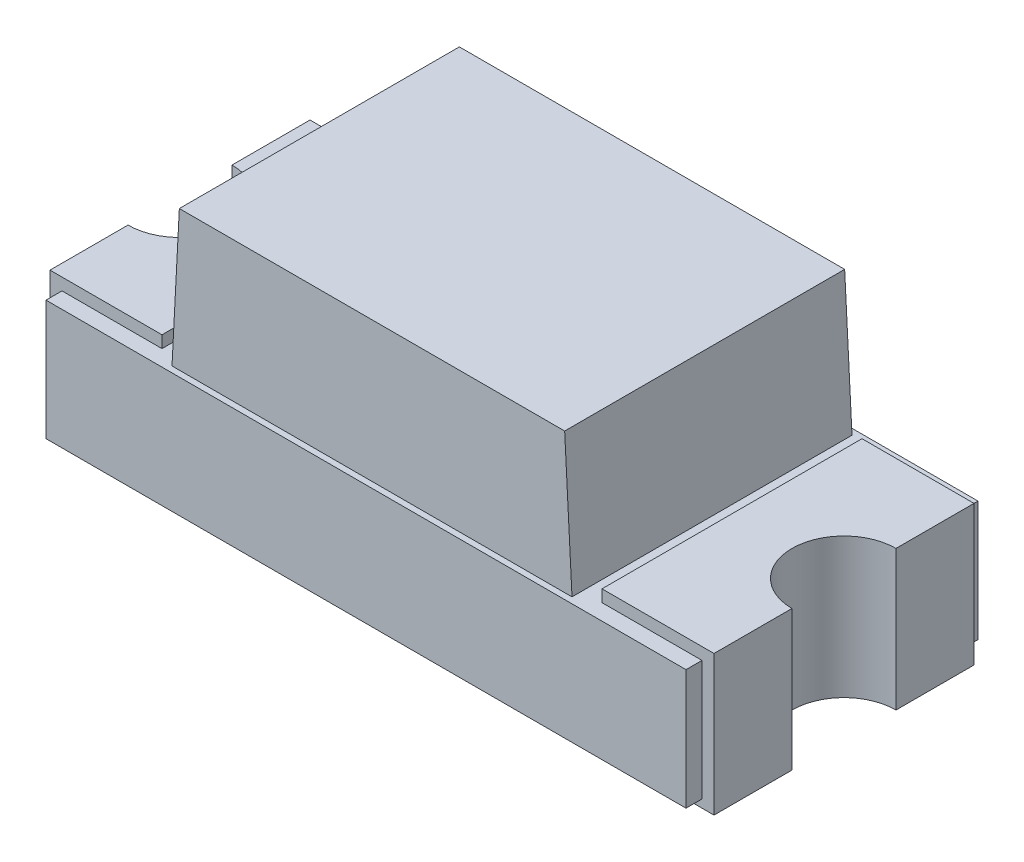
ISO-10303-21;
HEADER;
FILE_DESCRIPTION(('STEP AP214'),'2;1');
FILE_NAME('part.step','',(''),(''),'','','');
FILE_SCHEMA(('AUTOMOTIVE_DESIGN { 1 0 10303 214 1 1 1 1 }'));
ENDSEC;
DATA;
#1=APPLICATION_CONTEXT('core data for automotive mechanical design processes');
#2=APPLICATION_PROTOCOL_DEFINITION('international standard','automotive_design',2000,#1);
#3=PRODUCT_CONTEXT('',#1,'mechanical');
#4=PRODUCT('Part','Part','',(#3));
#5=PRODUCT_RELATED_PRODUCT_CATEGORY('part','',(#4));
#6=PRODUCT_DEFINITION_FORMATION('','',#4);
#7=PRODUCT_DEFINITION_CONTEXT('part definition',#1,'design');
#8=PRODUCT_DEFINITION('design','',#6,#7);
#9=PRODUCT_DEFINITION_SHAPE('','',#8);
#10=(LENGTH_UNIT() NAMED_UNIT(*) SI_UNIT(.MILLI.,.METRE.));
#11=(NAMED_UNIT(*) PLANE_ANGLE_UNIT() SI_UNIT($,.RADIAN.));
#12=(NAMED_UNIT(*) SI_UNIT($,.STERADIAN.) SOLID_ANGLE_UNIT());
#13=UNCERTAINTY_MEASURE_WITH_UNIT(LENGTH_MEASURE(1.E-05),#10,'distance_accuracy_value','');
#14=(GEOMETRIC_REPRESENTATION_CONTEXT(3) GLOBAL_UNCERTAINTY_ASSIGNED_CONTEXT((#13)) GLOBAL_UNIT_ASSIGNED_CONTEXT((#10,
#11,#12)) REPRESENTATION_CONTEXT('',''));
#15=CARTESIAN_POINT('',(0.,0.,0.));
#16=DIRECTION('',(0.,0.,1.));
#17=DIRECTION('',(1.,0.,0.));
#18=AXIS2_PLACEMENT_3D('',#15,#16,#17);
#19=CARTESIAN_POINT('',(0.,0.15,0.));
#20=DIRECTION('',(0.,1.,0.));
#21=DIRECTION('',(0.,0.,1.));
#22=AXIS2_PLACEMENT_3D('',#19,#20,#21);
#23=PLANE('',#22);
#24=DIRECTION('',(0.,0.,-1.));
#25=VECTOR('',#24,1.);
#26=CARTESIAN_POINT('',(0.800000000000004,0.15,-0.365));
#27=LINE('',#26,#25);
#28=CARTESIAN_POINT('',(0.800000000000004,0.15,0.365));
#29=VERTEX_POINT('',#28);
#30=CARTESIAN_POINT('',(0.800000000000004,0.15,0.325));
#31=VERTEX_POINT('',#30);
#32=EDGE_CURVE('E224',#29,#31,#27,.T.);
#33=ORIENTED_EDGE('',*,*,#32,.T.);
#34=DIRECTION('',(-1.,0.,0.));
#35=VECTOR('',#34,1.);
#36=CARTESIAN_POINT('',(0.,0.15,0.325));
#37=LINE('',#36,#35);
#38=CARTESIAN_POINT('',(0.549999999999996,0.15,0.325));
#39=VERTEX_POINT('',#38);
#40=EDGE_CURVE('E218',#31,#39,#37,.T.);
#41=ORIENTED_EDGE('',*,*,#40,.T.);
#42=DIRECTION('',(0.,0.,-1.));
#43=VECTOR('',#42,1.);
#44=CARTESIAN_POINT('',(0.549999999999996,0.15,0.));
#45=LINE('',#44,#43);
#46=CARTESIAN_POINT('',(0.549999999999996,0.15,-0.325));
#47=VERTEX_POINT('',#46);
#48=EDGE_CURVE('E221',#39,#47,#45,.T.);
#49=ORIENTED_EDGE('',*,*,#48,.T.);
#50=DIRECTION('',(1.,0.,0.));
#51=VECTOR('',#50,1.);
#52=CARTESIAN_POINT('',(0.,0.15,-0.325));
#53=LINE('',#52,#51);
#54=CARTESIAN_POINT('',(0.800000000000004,0.15,-0.325));
#55=VERTEX_POINT('',#54);
#56=EDGE_CURVE('E238',#47,#55,#53,.T.);
#57=ORIENTED_EDGE('',*,*,#56,.T.);
#58=CARTESIAN_POINT('',(0.800000000000004,0.15,-0.365));
#59=VERTEX_POINT('',#58);
#60=EDGE_CURVE('E323',#55,#59,#27,.T.);
#61=ORIENTED_EDGE('',*,*,#60,.T.);
#62=DIRECTION('',(-1.,0.,0.));
#63=VECTOR('',#62,1.);
#64=CARTESIAN_POINT('',(-0.799999999999996,0.15,-0.365));
#65=LINE('',#64,#63);
#66=CARTESIAN_POINT('',(-0.799999999999996,0.15,-0.365));
#67=VERTEX_POINT('',#66);
#68=EDGE_CURVE('E322',#59,#67,#65,.T.);
#69=ORIENTED_EDGE('',*,*,#68,.T.);
#70=DIRECTION('',(0.,0.,1.));
#71=VECTOR('',#70,1.);
#72=CARTESIAN_POINT('',(-0.799999999999996,0.15,-0.365));
#73=LINE('',#72,#71);
#74=CARTESIAN_POINT('',(-0.799999999999996,0.15,-0.325));
#75=VERTEX_POINT('',#74);
#76=EDGE_CURVE('E326',#67,#75,#73,.T.);
#77=ORIENTED_EDGE('',*,*,#76,.T.);
#78=DIRECTION('',(-1.,0.,0.));
#79=VECTOR('',#78,1.);
#80=CARTESIAN_POINT('',(0.,0.15,-0.325));
#81=LINE('',#80,#79);
#82=CARTESIAN_POINT('',(-0.549999999999996,0.15,-0.325));
#83=VERTEX_POINT('',#82);
#84=EDGE_CURVE('E318',#83,#75,#81,.T.);
#85=ORIENTED_EDGE('',*,*,#84,.F.);
#86=DIRECTION('',(0.,0.,-1.));
#87=VECTOR('',#86,1.);
#88=CARTESIAN_POINT('',(-0.549999999999996,0.15,0.));
#89=LINE('',#88,#87);
#90=CARTESIAN_POINT('',(-0.549999999999996,0.15,0.325));
#91=VERTEX_POINT('',#90);
#92=EDGE_CURVE('E313',#91,#83,#89,.T.);
#93=ORIENTED_EDGE('',*,*,#92,.F.);
#94=DIRECTION('',(1.,0.,0.));
#95=VECTOR('',#94,1.);
#96=CARTESIAN_POINT('',(0.,0.15,0.325));
#97=LINE('',#96,#95);
#98=CARTESIAN_POINT('',(-0.799999999999996,0.15,0.325));
#99=VERTEX_POINT('',#98);
#100=EDGE_CURVE('E311',#99,#91,#97,.T.);
#101=ORIENTED_EDGE('',*,*,#100,.F.);
#102=CARTESIAN_POINT('',(-0.799999999999996,0.15,0.365));
#103=VERTEX_POINT('',#102);
#104=EDGE_CURVE('E325',#99,#103,#73,.T.);
#105=ORIENTED_EDGE('',*,*,#104,.T.);
#106=DIRECTION('',(1.,0.,0.));
#107=VECTOR('',#106,1.);
#108=CARTESIAN_POINT('',(-0.799999999999996,0.15,0.365));
#109=LINE('',#108,#107);
#110=EDGE_CURVE('E329',#103,#29,#109,.T.);
#111=ORIENTED_EDGE('',*,*,#110,.T.);
#112=EDGE_LOOP('',(#33,#41,#49,#57,#61,#69,#77,#85,#93,#101,#105,#111));
#113=FACE_BOUND('',#112,.T.);
#114=DIRECTION('',(1.,0.,0.));
#115=VECTOR('',#114,1.);
#116=CARTESIAN_POINT('',(0.5,0.15,0.35));
#117=LINE('',#116,#115);
#118=CARTESIAN_POINT('',(-0.5,0.15,0.35));
#119=VERTEX_POINT('',#118);
#120=CARTESIAN_POINT('',(0.5,0.15,0.35));
#121=VERTEX_POINT('',#120);
#122=EDGE_CURVE('E390',#119,#121,#117,.T.);
#123=ORIENTED_EDGE('',*,*,#122,.F.);
#124=DIRECTION('',(0.,0.,1.));
#125=VECTOR('',#124,1.);
#126=CARTESIAN_POINT('',(-0.5,0.15,0.35));
#127=LINE('',#126,#125);
#128=CARTESIAN_POINT('',(-0.5,0.15,-0.35));
#129=VERTEX_POINT('',#128);
#130=EDGE_CURVE('E717',#129,#119,#127,.T.);
#131=ORIENTED_EDGE('',*,*,#130,.F.);
#132=DIRECTION('',(-1.,0.,0.));
#133=VECTOR('',#132,1.);
#134=CARTESIAN_POINT('',(0.5,0.15,-0.35));
#135=LINE('',#134,#133);
#136=CARTESIAN_POINT('',(0.5,0.15,-0.35));
#137=VERTEX_POINT('',#136);
#138=EDGE_CURVE('E383',#137,#129,#135,.T.);
#139=ORIENTED_EDGE('',*,*,#138,.F.);
#140=DIRECTION('',(0.,0.,-1.));
#141=VECTOR('',#140,1.);
#142=CARTESIAN_POINT('',(0.5,0.15,0.35));
#143=LINE('',#142,#141);
#144=EDGE_CURVE('E387',#121,#137,#143,.T.);
#145=ORIENTED_EDGE('',*,*,#144,.F.);
#146=EDGE_LOOP('',(#123,#131,#139,#145));
#147=FACE_BOUND('',#146,.T.);
#148=ADVANCED_FACE('F34',(#113,#147),#23,.T.);
#149=CARTESIAN_POINT('',(0.829999999999996,-0.17,-0.325));
#150=DIRECTION('',(-1.,0.,0.));
#151=DIRECTION('',(0.,0.,1.));
#152=AXIS2_PLACEMENT_3D('',#149,#150,#151);
#153=PLANE('',#152);
#154=DIRECTION('',(0.,1.,0.));
#155=VECTOR('',#154,1.);
#156=CARTESIAN_POINT('',(0.829999999999996,-0.5,0.13));
#157=LINE('',#156,#155);
#158=CARTESIAN_POINT('',(0.829999999999996,0.18,0.13));
#159=VERTEX_POINT('',#158);
#160=CARTESIAN_POINT('',(0.829999999999996,-0.17,0.13));
#161=VERTEX_POINT('',#160);
#162=EDGE_CURVE('E396',#159,#161,#157,.F.);
#163=ORIENTED_EDGE('',*,*,#162,.F.);
#164=DIRECTION('',(0.,0.,1.));
#165=VECTOR('',#164,1.);
#166=CARTESIAN_POINT('',(0.829999999999996,0.18,-0.325));
#167=LINE('',#166,#165);
#168=CARTESIAN_POINT('',(0.829999999999996,0.18,0.325));
#169=VERTEX_POINT('',#168);
#170=EDGE_CURVE('E400',#159,#169,#167,.T.);
#171=ORIENTED_EDGE('',*,*,#170,.T.);
#172=DIRECTION('',(0.,1.,0.));
#173=VECTOR('',#172,1.);
#174=CARTESIAN_POINT('',(0.829999999999996,-0.17,0.325));
#175=LINE('',#174,#173);
#176=CARTESIAN_POINT('',(0.829999999999996,-0.17,0.325));
#177=VERTEX_POINT('',#176);
#178=EDGE_CURVE('E249',#177,#169,#175,.T.);
#179=ORIENTED_EDGE('',*,*,#178,.F.);
#180=DIRECTION('',(0.,0.,1.));
#181=VECTOR('',#180,1.);
#182=CARTESIAN_POINT('',(0.829999999999996,-0.17,-0.325));
#183=LINE('',#182,#181);
#184=EDGE_CURVE('E405',#161,#177,#183,.T.);
#185=ORIENTED_EDGE('',*,*,#184,.F.);
#186=EDGE_LOOP('',(#163,#171,#179,#185));
#187=FACE_BOUND('',#186,.T.);
#188=ADVANCED_FACE('F425',(#187),#153,.F.);
#189=DIRECTION('',(0.,1.,0.));
#190=VECTOR('',#189,1.);
#191=CARTESIAN_POINT('',(0.829999999999996,-0.5,-0.13));
#192=LINE('',#191,#190);
#193=CARTESIAN_POINT('',(0.829999999999996,-0.17,-0.13));
#194=VERTEX_POINT('',#193);
#195=CARTESIAN_POINT('',(0.829999999999996,0.18,-0.13));
#196=VERTEX_POINT('',#195);
#197=EDGE_CURVE('E394',#194,#196,#192,.T.);
#198=ORIENTED_EDGE('',*,*,#197,.F.);
#199=CARTESIAN_POINT('',(0.829999999999996,-0.17,-0.325));
#200=VERTEX_POINT('',#199);
#201=EDGE_CURVE('E401',#200,#194,#183,.T.);
#202=ORIENTED_EDGE('',*,*,#201,.F.);
#203=DIRECTION('',(0.,1.,0.));
#204=VECTOR('',#203,1.);
#205=CARTESIAN_POINT('',(0.829999999999996,-0.17,-0.325));
#206=LINE('',#205,#204);
#207=CARTESIAN_POINT('',(0.829999999999996,0.18,-0.325));
#208=VERTEX_POINT('',#207);
#209=EDGE_CURVE('E255',#200,#208,#206,.T.);
#210=ORIENTED_EDGE('',*,*,#209,.T.);
#211=EDGE_CURVE('E410',#208,#196,#167,.T.);
#212=ORIENTED_EDGE('',*,*,#211,.T.);
#213=EDGE_LOOP('',(#198,#202,#210,#212));
#214=FACE_BOUND('',#213,.T.);
#215=ADVANCED_FACE('F438',(#214),#153,.F.);
#216=CARTESIAN_POINT('',(0.,-0.17,0.));
#217=DIRECTION('',(0.,1.,0.));
#218=DIRECTION('',(0.,0.,1.));
#219=AXIS2_PLACEMENT_3D('',#216,#217,#218);
#220=PLANE('',#219);
#221=CARTESIAN_POINT('',(0.829999999999996,-0.17,0.));
#222=DIRECTION('',(0.,1.,0.));
#223=DIRECTION('',(0.,0.,1.));
#224=AXIS2_PLACEMENT_3D('',#221,#222,#223);
#225=CIRCLE('',#224,0.13);
#226=EDGE_CURVE('E398',#161,#194,#225,.F.);
#227=ORIENTED_EDGE('',*,*,#226,.F.);
#228=ORIENTED_EDGE('',*,*,#184,.T.);
#229=DIRECTION('',(-1.,0.,0.));
#230=VECTOR('',#229,1.);
#231=CARTESIAN_POINT('',(0.829999999999996,-0.17,0.325));
#232=LINE('',#231,#230);
#233=CARTESIAN_POINT('',(0.549999999999996,-0.17,0.325));
#234=VERTEX_POINT('',#233);
#235=EDGE_CURVE('E258',#177,#234,#232,.T.);
#236=ORIENTED_EDGE('',*,*,#235,.T.);
#237=DIRECTION('',(0.,0.,-1.));
#238=VECTOR('',#237,1.);
#239=CARTESIAN_POINT('',(0.549999999999996,-0.17,-0.325));
#240=LINE('',#239,#238);
#241=CARTESIAN_POINT('',(0.549999999999996,-0.17,-0.325));
#242=VERTEX_POINT('',#241);
#243=EDGE_CURVE('E407',#234,#242,#240,.T.);
#244=ORIENTED_EDGE('',*,*,#243,.T.);
#245=DIRECTION('',(1.,0.,0.));
#246=VECTOR('',#245,1.);
#247=CARTESIAN_POINT('',(0.829999999999996,-0.17,-0.325));
#248=LINE('',#247,#246);
#249=EDGE_CURVE('E404',#242,#200,#248,.T.);
#250=ORIENTED_EDGE('',*,*,#249,.T.);
#251=ORIENTED_EDGE('',*,*,#201,.T.);
#252=EDGE_LOOP('',(#227,#228,#236,#244,#250,#251));
#253=FACE_BOUND('',#252,.T.);
#254=ADVANCED_FACE('F420',(#253),#220,.F.);
#255=CARTESIAN_POINT('',(0.,0.18,0.));
#256=DIRECTION('',(0.,1.,0.));
#257=DIRECTION('',(0.,0.,1.));
#258=AXIS2_PLACEMENT_3D('',#255,#256,#257);
#259=PLANE('',#258);
#260=ORIENTED_EDGE('',*,*,#170,.F.);
#261=CARTESIAN_POINT('',(0.829999999999996,0.18,0.));
#262=DIRECTION('',(0.,1.,0.));
#263=DIRECTION('',(0.,0.,1.));
#264=AXIS2_PLACEMENT_3D('',#261,#262,#263);
#265=CIRCLE('',#264,0.13);
#266=EDGE_CURVE('E11',#159,#196,#265,.F.);
#267=ORIENTED_EDGE('',*,*,#266,.T.);
#268=ORIENTED_EDGE('',*,*,#211,.F.);
#269=DIRECTION('',(1.,0.,0.));
#270=VECTOR('',#269,1.);
#271=CARTESIAN_POINT('',(0.829999999999996,0.18,-0.325));
#272=LINE('',#271,#270);
#273=CARTESIAN_POINT('',(0.549999999999996,0.18,-0.325));
#274=VERTEX_POINT('',#273);
#275=EDGE_CURVE('E413',#274,#208,#272,.T.);
#276=ORIENTED_EDGE('',*,*,#275,.F.);
#277=DIRECTION('',(0.,0.,-1.));
#278=VECTOR('',#277,1.);
#279=CARTESIAN_POINT('',(0.549999999999996,0.18,-0.325));
#280=LINE('',#279,#278);
#281=CARTESIAN_POINT('',(0.549999999999996,0.18,0.325));
#282=VERTEX_POINT('',#281);
#283=EDGE_CURVE('E415',#282,#274,#280,.T.);
#284=ORIENTED_EDGE('',*,*,#283,.F.);
#285=DIRECTION('',(-1.,0.,0.));
#286=VECTOR('',#285,1.);
#287=CARTESIAN_POINT('',(0.829999999999996,0.18,0.325));
#288=LINE('',#287,#286);
#289=EDGE_CURVE('E243',#169,#282,#288,.T.);
#290=ORIENTED_EDGE('',*,*,#289,.F.);
#291=EDGE_LOOP('',(#260,#267,#268,#276,#284,#290));
#292=FACE_BOUND('',#291,.T.);
#293=ADVANCED_FACE('F428',(#292),#259,.T.);
#294=CARTESIAN_POINT('',(0.800000000000004,0.15,-0.365));
#295=DIRECTION('',(-1.,0.,0.));
#296=DIRECTION('',(0.,0.,1.));
#297=AXIS2_PLACEMENT_3D('',#294,#295,#296);
#298=PLANE('',#297);
#299=DIRECTION('',(0.,-1.,0.));
#300=VECTOR('',#299,1.);
#301=CARTESIAN_POINT('',(0.800000000000004,0.15,0.325));
#302=LINE('',#301,#300);
#303=CARTESIAN_POINT('',(0.800000000000004,-0.15,0.325));
#304=VERTEX_POINT('',#303);
#305=EDGE_CURVE('E229',#31,#304,#302,.T.);
#306=ORIENTED_EDGE('',*,*,#305,.F.);
#307=ORIENTED_EDGE('',*,*,#32,.F.);
#308=DIRECTION('',(0.,-1.,0.));
#309=VECTOR('',#308,1.);
#310=CARTESIAN_POINT('',(0.800000000000004,0.15,0.365));
#311=LINE('',#310,#309);
#312=CARTESIAN_POINT('',(0.800000000000004,-0.15,0.365));
#313=VERTEX_POINT('',#312);
#314=EDGE_CURVE('E331',#29,#313,#311,.T.);
#315=ORIENTED_EDGE('',*,*,#314,.T.);
#316=DIRECTION('',(0.,0.,-1.));
#317=VECTOR('',#316,1.);
#318=CARTESIAN_POINT('',(0.800000000000004,-0.15,-0.365));
#319=LINE('',#318,#317);
#320=EDGE_CURVE('E332',#313,#304,#319,.T.);
#321=ORIENTED_EDGE('',*,*,#320,.T.);
#322=EDGE_LOOP('',(#306,#307,#315,#321));
#323=FACE_BOUND('',#322,.T.);
#324=ADVANCED_FACE('F446',(#323),#298,.F.);
#325=DIRECTION('',(0.,1.,0.));
#326=VECTOR('',#325,1.);
#327=CARTESIAN_POINT('',(0.800000000000004,0.15,-0.325));
#328=LINE('',#327,#326);
#329=CARTESIAN_POINT('',(0.800000000000004,-0.15,-0.325));
#330=VERTEX_POINT('',#329);
#331=EDGE_CURVE('E259',#330,#55,#328,.T.);
#332=ORIENTED_EDGE('',*,*,#331,.F.);
#333=CARTESIAN_POINT('',(0.800000000000004,-0.15,-0.365));
#334=VERTEX_POINT('',#333);
#335=EDGE_CURVE('E320',#330,#334,#319,.T.);
#336=ORIENTED_EDGE('',*,*,#335,.T.);
#337=DIRECTION('',(0.,-1.,0.));
#338=VECTOR('',#337,1.);
#339=CARTESIAN_POINT('',(0.800000000000004,0.15,-0.365));
#340=LINE('',#339,#338);
#341=EDGE_CURVE('E351',#59,#334,#340,.T.);
#342=ORIENTED_EDGE('',*,*,#341,.F.);
#343=ORIENTED_EDGE('',*,*,#60,.F.);
#344=EDGE_LOOP('',(#332,#336,#342,#343));
#345=FACE_BOUND('',#344,.T.);
#346=ADVANCED_FACE('F501',(#345),#298,.F.);
#347=CARTESIAN_POINT('',(0.,-0.15,0.));
#348=DIRECTION('',(0.,1.,0.));
#349=DIRECTION('',(0.,0.,1.));
#350=AXIS2_PLACEMENT_3D('',#347,#348,#349);
#351=PLANE('',#350);
#352=DIRECTION('',(-1.,0.,0.));
#353=VECTOR('',#352,1.);
#354=CARTESIAN_POINT('',(0.,-0.15,0.325));
#355=LINE('',#354,#353);
#356=CARTESIAN_POINT('',(0.549999999999996,-0.15,0.325));
#357=VERTEX_POINT('',#356);
#358=EDGE_CURVE('E44',#304,#357,#355,.T.);
#359=ORIENTED_EDGE('',*,*,#358,.F.);
#360=ORIENTED_EDGE('',*,*,#320,.F.);
#361=DIRECTION('',(1.,0.,0.));
#362=VECTOR('',#361,1.);
#363=CARTESIAN_POINT('',(-0.799999999999996,-0.15,0.365));
#364=LINE('',#363,#362);
#365=CARTESIAN_POINT('',(-0.799999999999996,-0.15,0.365));
#366=VERTEX_POINT('',#365);
#367=EDGE_CURVE('E341',#366,#313,#364,.T.);
#368=ORIENTED_EDGE('',*,*,#367,.F.);
#369=DIRECTION('',(0.,0.,1.));
#370=VECTOR('',#369,1.);
#371=CARTESIAN_POINT('',(-0.799999999999996,-0.15,-0.365));
#372=LINE('',#371,#370);
#373=CARTESIAN_POINT('',(-0.799999999999996,-0.15,0.325));
#374=VERTEX_POINT('',#373);
#375=EDGE_CURVE('E337',#374,#366,#372,.T.);
#376=ORIENTED_EDGE('',*,*,#375,.F.);
#377=DIRECTION('',(1.,0.,0.));
#378=VECTOR('',#377,1.);
#379=CARTESIAN_POINT('',(0.,-0.15,0.325));
#380=LINE('',#379,#378);
#381=CARTESIAN_POINT('',(-0.549999999999996,-0.15,0.325));
#382=VERTEX_POINT('',#381);
#383=EDGE_CURVE('E354',#374,#382,#380,.T.);
#384=ORIENTED_EDGE('',*,*,#383,.T.);
#385=DIRECTION('',(0.,0.,-1.));
#386=VECTOR('',#385,1.);
#387=CARTESIAN_POINT('',(-0.549999999999996,-0.15,0.));
#388=LINE('',#387,#386);
#389=CARTESIAN_POINT('',(-0.549999999999996,-0.15,-0.325));
#390=VERTEX_POINT('',#389);
#391=EDGE_CURVE('E357',#382,#390,#388,.T.);
#392=ORIENTED_EDGE('',*,*,#391,.T.);
#393=DIRECTION('',(-1.,0.,0.));
#394=VECTOR('',#393,1.);
#395=CARTESIAN_POINT('',(0.,-0.15,-0.325));
#396=LINE('',#395,#394);
#397=CARTESIAN_POINT('',(-0.799999999999996,-0.15,-0.325));
#398=VERTEX_POINT('',#397);
#399=EDGE_CURVE('E360',#390,#398,#396,.T.);
#400=ORIENTED_EDGE('',*,*,#399,.T.);
#401=CARTESIAN_POINT('',(-0.799999999999996,-0.15,-0.365));
#402=VERTEX_POINT('',#401);
#403=EDGE_CURVE('E338',#402,#398,#372,.T.);
#404=ORIENTED_EDGE('',*,*,#403,.F.);
#405=DIRECTION('',(-1.,0.,0.));
#406=VECTOR('',#405,1.);
#407=CARTESIAN_POINT('',(-0.799999999999996,-0.15,-0.365));
#408=LINE('',#407,#406);
#409=EDGE_CURVE('E335',#334,#402,#408,.T.);
#410=ORIENTED_EDGE('',*,*,#409,.F.);
#411=ORIENTED_EDGE('',*,*,#335,.F.);
#412=DIRECTION('',(1.,0.,0.));
#413=VECTOR('',#412,1.);
#414=CARTESIAN_POINT('',(0.,-0.15,-0.325));
#415=LINE('',#414,#413);
#416=CARTESIAN_POINT('',(0.549999999999996,-0.15,-0.325));
#417=VERTEX_POINT('',#416);
#418=EDGE_CURVE('E365',#417,#330,#415,.T.);
#419=ORIENTED_EDGE('',*,*,#418,.F.);
#420=DIRECTION('',(0.,0.,-1.));
#421=VECTOR('',#420,1.);
#422=CARTESIAN_POINT('',(0.549999999999996,-0.15,0.));
#423=LINE('',#422,#421);
#424=EDGE_CURVE('E368',#357,#417,#423,.T.);
#425=ORIENTED_EDGE('',*,*,#424,.F.);
#426=EDGE_LOOP('',(#359,#360,#368,#376,#384,#392,#400,#404,#410,#411,#419,#425));
#427=FACE_BOUND('',#426,.T.);
#428=ADVANCED_FACE('F443',(#427),#351,.F.);
#429=CARTESIAN_POINT('',(-0.829999999999996,-0.17,-0.325));
#430=DIRECTION('',(-1.,0.,0.));
#431=DIRECTION('',(0.,0.,1.));
#432=AXIS2_PLACEMENT_3D('',#429,#430,#431);
#433=PLANE('',#432);
#434=DIRECTION('',(0.,1.,0.));
#435=VECTOR('',#434,1.);
#436=CARTESIAN_POINT('',(-0.829999999999996,-0.5,0.13));
#437=LINE('',#436,#435);
#438=CARTESIAN_POINT('',(-0.829999999999996,-0.17,0.13));
#439=VERTEX_POINT('',#438);
#440=CARTESIAN_POINT('',(-0.829999999999996,0.18,0.13));
#441=VERTEX_POINT('',#440);
#442=EDGE_CURVE('E265',#439,#441,#437,.T.);
#443=ORIENTED_EDGE('',*,*,#442,.F.);
#444=DIRECTION('',(0.,0.,1.));
#445=VECTOR('',#444,1.);
#446=CARTESIAN_POINT('',(-0.829999999999996,-0.17,-0.325));
#447=LINE('',#446,#445);
#448=CARTESIAN_POINT('',(-0.829999999999996,-0.17,0.325));
#449=VERTEX_POINT('',#448);
#450=EDGE_CURVE('E275',#439,#449,#447,.T.);
#451=ORIENTED_EDGE('',*,*,#450,.T.);
#452=DIRECTION('',(0.,1.,0.));
#453=VECTOR('',#452,1.);
#454=CARTESIAN_POINT('',(-0.829999999999996,-0.17,0.325));
#455=LINE('',#454,#453);
#456=CARTESIAN_POINT('',(-0.829999999999996,0.18,0.325));
#457=VERTEX_POINT('',#456);
#458=EDGE_CURVE('E284',#449,#457,#455,.T.);
#459=ORIENTED_EDGE('',*,*,#458,.T.);
#460=DIRECTION('',(0.,0.,1.));
#461=VECTOR('',#460,1.);
#462=CARTESIAN_POINT('',(-0.829999999999996,0.18,-0.325));
#463=LINE('',#462,#461);
#464=EDGE_CURVE('E270',#441,#457,#463,.T.);
#465=ORIENTED_EDGE('',*,*,#464,.F.);
#466=EDGE_LOOP('',(#443,#451,#459,#465));
#467=FACE_BOUND('',#466,.T.);
#468=ADVANCED_FACE('F508',(#467),#433,.T.);
#469=CARTESIAN_POINT('',(-0.799999999999996,0.15,-0.365));
#470=DIRECTION('',(1.,0.,0.));
#471=DIRECTION('',(0.,0.,-1.));
#472=AXIS2_PLACEMENT_3D('',#469,#470,#471);
#473=PLANE('',#472);
#474=ORIENTED_EDGE('',*,*,#403,.T.);
#475=DIRECTION('',(0.,1.,0.));
#476=VECTOR('',#475,1.);
#477=CARTESIAN_POINT('',(-0.799999999999996,0.15,-0.325));
#478=LINE('',#477,#476);
#479=EDGE_CURVE('E315',#398,#75,#478,.T.);
#480=ORIENTED_EDGE('',*,*,#479,.T.);
#481=ORIENTED_EDGE('',*,*,#76,.F.);
#482=DIRECTION('',(0.,-1.,0.));
#483=VECTOR('',#482,1.);
#484=CARTESIAN_POINT('',(-0.799999999999996,0.15,-0.365));
#485=LINE('',#484,#483);
#486=EDGE_CURVE('E348',#67,#402,#485,.T.);
#487=ORIENTED_EDGE('',*,*,#486,.T.);
#488=EDGE_LOOP('',(#474,#480,#481,#487));
#489=FACE_BOUND('',#488,.T.);
#490=ADVANCED_FACE('F491',(#489),#473,.F.);
#491=CARTESIAN_POINT('',(-0.799999999999996,0.15,-0.365));
#492=DIRECTION('',(0.,0.,1.));
#493=DIRECTION('',(1.,0.,0.));
#494=AXIS2_PLACEMENT_3D('',#491,#492,#493);
#495=PLANE('',#494);
#496=ORIENTED_EDGE('',*,*,#409,.T.);
#497=ORIENTED_EDGE('',*,*,#486,.F.);
#498=ORIENTED_EDGE('',*,*,#68,.F.);
#499=ORIENTED_EDGE('',*,*,#341,.T.);
#500=EDGE_LOOP('',(#496,#497,#498,#499));
#501=FACE_BOUND('',#500,.T.);
#502=ADVANCED_FACE('F496',(#501),#495,.F.);
#503=ORIENTED_EDGE('',*,*,#104,.F.);
#504=DIRECTION('',(0.,-1.,0.));
#505=VECTOR('',#504,1.);
#506=CARTESIAN_POINT('',(-0.799999999999996,0.15,0.325));
#507=LINE('',#506,#505);
#508=EDGE_CURVE('E299',#99,#374,#507,.T.);
#509=ORIENTED_EDGE('',*,*,#508,.T.);
#510=ORIENTED_EDGE('',*,*,#375,.T.);
#511=DIRECTION('',(0.,-1.,0.));
#512=VECTOR('',#511,1.);
#513=CARTESIAN_POINT('',(-0.799999999999996,0.15,0.365));
#514=LINE('',#513,#512);
#515=EDGE_CURVE('E345',#103,#366,#514,.T.);
#516=ORIENTED_EDGE('',*,*,#515,.F.);
#517=EDGE_LOOP('',(#503,#509,#510,#516));
#518=FACE_BOUND('',#517,.T.);
#519=ADVANCED_FACE('F456',(#518),#473,.F.);
#520=CARTESIAN_POINT('',(-0.799999999999996,0.15,0.365));
#521=DIRECTION('',(0.,0.,-1.));
#522=DIRECTION('',(-1.,0.,0.));
#523=AXIS2_PLACEMENT_3D('',#520,#521,#522);
#524=PLANE('',#523);
#525=ORIENTED_EDGE('',*,*,#367,.T.);
#526=ORIENTED_EDGE('',*,*,#314,.F.);
#527=ORIENTED_EDGE('',*,*,#110,.F.);
#528=ORIENTED_EDGE('',*,*,#515,.T.);
#529=EDGE_LOOP('',(#525,#526,#527,#528));
#530=FACE_BOUND('',#529,.T.);
#531=ADVANCED_FACE('F451',(#530),#524,.F.);
#532=CARTESIAN_POINT('',(-0.549999999999996,-0.17,-0.325));
#533=DIRECTION('',(1.,0.,0.));
#534=DIRECTION('',(0.,0.,-1.));
#535=AXIS2_PLACEMENT_3D('',#532,#533,#534);
#536=PLANE('',#535);
#537=ORIENTED_EDGE('',*,*,#391,.F.);
#538=DIRECTION('',(0.,1.,0.));
#539=VECTOR('',#538,1.);
#540=CARTESIAN_POINT('',(-0.549999999999996,-0.17,0.325));
#541=LINE('',#540,#539);
#542=CARTESIAN_POINT('',(-0.549999999999996,-0.17,0.325));
#543=VERTEX_POINT('',#542);
#544=EDGE_CURVE('E304',#543,#382,#541,.T.);
#545=ORIENTED_EDGE('',*,*,#544,.F.);
#546=DIRECTION('',(0.,0.,-1.));
#547=VECTOR('',#546,1.);
#548=CARTESIAN_POINT('',(-0.549999999999996,-0.17,-0.325));
#549=LINE('',#548,#547);
#550=CARTESIAN_POINT('',(-0.549999999999996,-0.17,-0.325));
#551=VERTEX_POINT('',#550);
#552=EDGE_CURVE('E278',#543,#551,#549,.T.);
#553=ORIENTED_EDGE('',*,*,#552,.T.);
#554=DIRECTION('',(0.,1.,0.));
#555=VECTOR('',#554,1.);
#556=CARTESIAN_POINT('',(-0.549999999999996,-0.17,-0.325));
#557=LINE('',#556,#555);
#558=EDGE_CURVE('E300',#551,#390,#557,.T.);
#559=ORIENTED_EDGE('',*,*,#558,.T.);
#560=EDGE_LOOP('',(#537,#545,#553,#559));
#561=FACE_BOUND('',#560,.T.);
#562=ADVANCED_FACE('F487',(#561),#536,.T.);
#563=DIRECTION('',(0.,1.,0.));
#564=VECTOR('',#563,1.);
#565=CARTESIAN_POINT('',(-0.829999999999996,-0.5,-0.13));
#566=LINE('',#565,#564);
#567=CARTESIAN_POINT('',(-0.829999999999996,0.18,-0.13));
#568=VERTEX_POINT('',#567);
#569=CARTESIAN_POINT('',(-0.829999999999996,-0.17,-0.13));
#570=VERTEX_POINT('',#569);
#571=EDGE_CURVE('E228',#568,#570,#566,.F.);
#572=ORIENTED_EDGE('',*,*,#571,.F.);
#573=CARTESIAN_POINT('',(-0.829999999999996,0.18,-0.325));
#574=VERTEX_POINT('',#573);
#575=EDGE_CURVE('E285',#574,#568,#463,.T.);
#576=ORIENTED_EDGE('',*,*,#575,.F.);
#577=DIRECTION('',(0.,1.,0.));
#578=VECTOR('',#577,1.);
#579=CARTESIAN_POINT('',(-0.829999999999996,-0.17,-0.325));
#580=LINE('',#579,#578);
#581=CARTESIAN_POINT('',(-0.829999999999996,-0.17,-0.325));
#582=VERTEX_POINT('',#581);
#583=EDGE_CURVE('E297',#582,#574,#580,.T.);
#584=ORIENTED_EDGE('',*,*,#583,.F.);
#585=EDGE_CURVE('E271',#582,#570,#447,.T.);
#586=ORIENTED_EDGE('',*,*,#585,.T.);
#587=EDGE_LOOP('',(#572,#576,#584,#586));
#588=FACE_BOUND('',#587,.T.);
#589=ADVANCED_FACE('F518',(#588),#433,.T.);
#590=CARTESIAN_POINT('',(-0.829999999999996,-0.17,-0.325));
#591=DIRECTION('',(0.,0.,-1.));
#592=DIRECTION('',(-1.,0.,0.));
#593=AXIS2_PLACEMENT_3D('',#590,#591,#592);
#594=PLANE('',#593);
#595=CARTESIAN_POINT('',(-0.549999999999996,0.18,-0.325));
#596=VERTEX_POINT('',#595);
#597=EDGE_CURVE('E303',#83,#596,#557,.T.);
#598=ORIENTED_EDGE('',*,*,#597,.F.);
#599=ORIENTED_EDGE('',*,*,#84,.T.);
#600=ORIENTED_EDGE('',*,*,#479,.F.);
#601=ORIENTED_EDGE('',*,*,#399,.F.);
#602=ORIENTED_EDGE('',*,*,#558,.F.);
#603=DIRECTION('',(-1.,0.,0.));
#604=VECTOR('',#603,1.);
#605=CARTESIAN_POINT('',(-0.829999999999996,-0.17,-0.325));
#606=LINE('',#605,#604);
#607=EDGE_CURVE('E281',#551,#582,#606,.T.);
#608=ORIENTED_EDGE('',*,*,#607,.T.);
#609=ORIENTED_EDGE('',*,*,#583,.T.);
#610=DIRECTION('',(-1.,0.,0.));
#611=VECTOR('',#610,1.);
#612=CARTESIAN_POINT('',(-0.829999999999996,0.18,-0.325));
#613=LINE('',#612,#611);
#614=EDGE_CURVE('E294',#596,#574,#613,.T.);
#615=ORIENTED_EDGE('',*,*,#614,.F.);
#616=EDGE_LOOP('',(#598,#599,#600,#601,#602,#608,#609,#615));
#617=FACE_BOUND('',#616,.T.);
#618=ADVANCED_FACE('F469',(#617),#594,.T.);
#619=CARTESIAN_POINT('',(-0.549999999999996,0.18,0.325));
#620=VERTEX_POINT('',#619);
#621=EDGE_CURVE('E306',#91,#620,#541,.T.);
#622=ORIENTED_EDGE('',*,*,#621,.F.);
#623=ORIENTED_EDGE('',*,*,#92,.T.);
#624=ORIENTED_EDGE('',*,*,#597,.T.);
#625=DIRECTION('',(0.,0.,-1.));
#626=VECTOR('',#625,1.);
#627=CARTESIAN_POINT('',(-0.549999999999996,0.18,-0.325));
#628=LINE('',#627,#626);
#629=EDGE_CURVE('E291',#620,#596,#628,.T.);
#630=ORIENTED_EDGE('',*,*,#629,.F.);
#631=EDGE_LOOP('',(#622,#623,#624,#630));
#632=FACE_BOUND('',#631,.T.);
#633=ADVANCED_FACE('F465',(#632),#536,.T.);
#634=CARTESIAN_POINT('',(-0.829999999999996,-0.17,0.325));
#635=DIRECTION('',(0.,0.,1.));
#636=DIRECTION('',(1.,0.,0.));
#637=AXIS2_PLACEMENT_3D('',#634,#635,#636);
#638=PLANE('',#637);
#639=ORIENTED_EDGE('',*,*,#508,.F.);
#640=ORIENTED_EDGE('',*,*,#100,.T.);
#641=ORIENTED_EDGE('',*,*,#621,.T.);
#642=DIRECTION('',(1.,0.,0.));
#643=VECTOR('',#642,1.);
#644=CARTESIAN_POINT('',(-0.829999999999996,0.18,0.325));
#645=LINE('',#644,#643);
#646=EDGE_CURVE('E288',#457,#620,#645,.T.);
#647=ORIENTED_EDGE('',*,*,#646,.F.);
#648=ORIENTED_EDGE('',*,*,#458,.F.);
#649=DIRECTION('',(1.,0.,0.));
#650=VECTOR('',#649,1.);
#651=CARTESIAN_POINT('',(-0.829999999999996,-0.17,0.325));
#652=LINE('',#651,#650);
#653=EDGE_CURVE('E274',#449,#543,#652,.T.);
#654=ORIENTED_EDGE('',*,*,#653,.T.);
#655=ORIENTED_EDGE('',*,*,#544,.T.);
#656=ORIENTED_EDGE('',*,*,#383,.F.);
#657=EDGE_LOOP('',(#639,#640,#641,#647,#648,#654,#655,#656));
#658=FACE_BOUND('',#657,.T.);
#659=ADVANCED_FACE('F459',(#658),#638,.T.);
#660=CARTESIAN_POINT('',(0.,-0.17,0.));
#661=DIRECTION('',(0.,1.,0.));
#662=DIRECTION('',(0.,0.,1.));
#663=AXIS2_PLACEMENT_3D('',#660,#661,#662);
#664=PLANE('',#663);
#665=ORIENTED_EDGE('',*,*,#450,.F.);
#666=CARTESIAN_POINT('',(-0.829999999999996,-0.17,0.));
#667=DIRECTION('',(0.,1.,0.));
#668=DIRECTION('',(0.,0.,1.));
#669=AXIS2_PLACEMENT_3D('',#666,#667,#668);
#670=CIRCLE('',#669,0.13);
#671=EDGE_CURVE('E267',#439,#570,#670,.T.);
#672=ORIENTED_EDGE('',*,*,#671,.T.);
#673=ORIENTED_EDGE('',*,*,#585,.F.);
#674=ORIENTED_EDGE('',*,*,#607,.F.);
#675=ORIENTED_EDGE('',*,*,#552,.F.);
#676=ORIENTED_EDGE('',*,*,#653,.F.);
#677=EDGE_LOOP('',(#665,#672,#673,#674,#675,#676));
#678=FACE_BOUND('',#677,.T.);
#679=ADVANCED_FACE('F482',(#678),#664,.F.);
#680=CARTESIAN_POINT('',(0.,0.18,0.));
#681=DIRECTION('',(0.,1.,0.));
#682=DIRECTION('',(0.,0.,1.));
#683=AXIS2_PLACEMENT_3D('',#680,#681,#682);
#684=PLANE('',#683);
#685=CARTESIAN_POINT('',(-0.829999999999996,0.18,0.));
#686=DIRECTION('',(0.,1.,0.));
#687=DIRECTION('',(0.,0.,1.));
#688=AXIS2_PLACEMENT_3D('',#685,#686,#687);
#689=CIRCLE('',#688,0.13);
#690=EDGE_CURVE('E363',#441,#568,#689,.T.);
#691=ORIENTED_EDGE('',*,*,#690,.F.);
#692=ORIENTED_EDGE('',*,*,#464,.T.);
#693=ORIENTED_EDGE('',*,*,#646,.T.);
#694=ORIENTED_EDGE('',*,*,#629,.T.);
#695=ORIENTED_EDGE('',*,*,#614,.T.);
#696=ORIENTED_EDGE('',*,*,#575,.T.);
#697=EDGE_LOOP('',(#691,#692,#693,#694,#695,#696));
#698=FACE_BOUND('',#697,.T.);
#699=ADVANCED_FACE('F473',(#698),#684,.T.);
#700=CARTESIAN_POINT('',(-0.829999999999996,-0.5,0.));
#701=DIRECTION('',(0.,1.,0.));
#702=DIRECTION('',(0.,0.,1.));
#703=AXIS2_PLACEMENT_3D('',#700,#701,#702);
#704=CYLINDRICAL_SURFACE('',#703,0.13);
#705=ORIENTED_EDGE('',*,*,#442,.T.);
#706=ORIENTED_EDGE('',*,*,#690,.T.);
#707=ORIENTED_EDGE('',*,*,#571,.T.);
#708=ORIENTED_EDGE('',*,*,#671,.F.);
#709=EDGE_LOOP('',(#705,#706,#707,#708));
#710=FACE_BOUND('',#709,.T.);
#711=ADVANCED_FACE('F544',(#710),#704,.F.);
#712=CARTESIAN_POINT('',(0.549999999999996,-0.17,-0.325));
#713=DIRECTION('',(1.,0.,0.));
#714=DIRECTION('',(0.,0.,-1.));
#715=AXIS2_PLACEMENT_3D('',#712,#713,#714);
#716=PLANE('',#715);
#717=DIRECTION('',(0.,1.,0.));
#718=VECTOR('',#717,1.);
#719=CARTESIAN_POINT('',(0.549999999999996,-0.17,0.325));
#720=LINE('',#719,#718);
#721=EDGE_CURVE('E245',#234,#357,#720,.T.);
#722=ORIENTED_EDGE('',*,*,#721,.T.);
#723=ORIENTED_EDGE('',*,*,#424,.T.);
#724=DIRECTION('',(0.,1.,0.));
#725=VECTOR('',#724,1.);
#726=CARTESIAN_POINT('',(0.549999999999996,-0.17,-0.325));
#727=LINE('',#726,#725);
#728=EDGE_CURVE('E246',#242,#417,#727,.T.);
#729=ORIENTED_EDGE('',*,*,#728,.F.);
#730=ORIENTED_EDGE('',*,*,#243,.F.);
#731=EDGE_LOOP('',(#722,#723,#729,#730));
#732=FACE_BOUND('',#731,.T.);
#733=ADVANCED_FACE('F441',(#732),#716,.F.);
#734=CARTESIAN_POINT('',(0.829999999999996,-0.17,0.325));
#735=DIRECTION('',(0.,0.,-1.));
#736=DIRECTION('',(-1.,0.,0.));
#737=AXIS2_PLACEMENT_3D('',#734,#735,#736);
#738=PLANE('',#737);
#739=ORIENTED_EDGE('',*,*,#40,.F.);
#740=ORIENTED_EDGE('',*,*,#305,.T.);
#741=ORIENTED_EDGE('',*,*,#358,.T.);
#742=ORIENTED_EDGE('',*,*,#721,.F.);
#743=ORIENTED_EDGE('',*,*,#235,.F.);
#744=ORIENTED_EDGE('',*,*,#178,.T.);
#745=ORIENTED_EDGE('',*,*,#289,.T.);
#746=EDGE_CURVE('E235',#39,#282,#720,.T.);
#747=ORIENTED_EDGE('',*,*,#746,.F.);
#748=EDGE_LOOP('',(#739,#740,#741,#742,#743,#744,#745,#747));
#749=FACE_BOUND('',#748,.T.);
#750=ADVANCED_FACE('F240',(#749),#738,.F.);
#751=ORIENTED_EDGE('',*,*,#48,.F.);
#752=ORIENTED_EDGE('',*,*,#746,.T.);
#753=ORIENTED_EDGE('',*,*,#283,.T.);
#754=EDGE_CURVE('E237',#47,#274,#727,.T.);
#755=ORIENTED_EDGE('',*,*,#754,.F.);
#756=EDGE_LOOP('',(#751,#752,#753,#755));
#757=FACE_BOUND('',#756,.T.);
#758=ADVANCED_FACE('F233',(#757),#716,.F.);
#759=CARTESIAN_POINT('',(0.829999999999996,-0.17,-0.325));
#760=DIRECTION('',(0.,0.,1.));
#761=DIRECTION('',(1.,0.,0.));
#762=AXIS2_PLACEMENT_3D('',#759,#760,#761);
#763=PLANE('',#762);
#764=ORIENTED_EDGE('',*,*,#56,.F.);
#765=ORIENTED_EDGE('',*,*,#754,.T.);
#766=ORIENTED_EDGE('',*,*,#275,.T.);
#767=ORIENTED_EDGE('',*,*,#209,.F.);
#768=ORIENTED_EDGE('',*,*,#249,.F.);
#769=ORIENTED_EDGE('',*,*,#728,.T.);
#770=ORIENTED_EDGE('',*,*,#418,.T.);
#771=ORIENTED_EDGE('',*,*,#331,.T.);
#772=EDGE_LOOP('',(#764,#765,#766,#767,#768,#769,#770,#771));
#773=FACE_BOUND('',#772,.T.);
#774=ADVANCED_FACE('F433',(#773),#763,.F.);
#775=CARTESIAN_POINT('',(0.829999999999996,-0.5,0.));
#776=DIRECTION('',(0.,1.,0.));
#777=DIRECTION('',(0.,0.,1.));
#778=AXIS2_PLACEMENT_3D('',#775,#776,#777);
#779=CYLINDRICAL_SURFACE('',#778,0.13);
#780=ORIENTED_EDGE('',*,*,#226,.T.);
#781=ORIENTED_EDGE('',*,*,#197,.T.);
#782=ORIENTED_EDGE('',*,*,#266,.F.);
#783=ORIENTED_EDGE('',*,*,#162,.T.);
#784=EDGE_LOOP('',(#780,#781,#782,#783));
#785=FACE_BOUND('',#784,.T.);
#786=ADVANCED_FACE('F651',(#785),#779,.F.);
#787=CARTESIAN_POINT('',(-0.5,0.15,0.35));
#788=DIRECTION('',(-0.998629534754574,0.0523359562429439,0.));
#789=DIRECTION('',(-0.052335956242944,-0.998629534754574,0.));
#790=AXIS2_PLACEMENT_3D('',#787,#788,#789);
#791=PLANE('',#790);
#792=ORIENTED_EDGE('',*,*,#130,.T.);
#793=DIRECTION('',(0.052335956242944,0.998629534754574,0.));
#794=VECTOR('',#793,1.);
#795=CARTESIAN_POINT('',(-0.478968466612297,0.551305563323275,0.35));
#796=LINE('',#795,#794);
#797=CARTESIAN_POINT('',(-0.481657277250935,0.5,0.35));
#798=VERTEX_POINT('',#797);
#799=EDGE_CURVE('E38',#798,#119,#796,.F.);
#800=ORIENTED_EDGE('',*,*,#799,.F.);
#801=DIRECTION('',(0.,0.,-1.));
#802=VECTOR('',#801,1.);
#803=CARTESIAN_POINT('',(-0.481657277250936,0.5,0.35));
#804=LINE('',#803,#802);
#805=CARTESIAN_POINT('',(-0.481657277250935,0.5,-0.35));
#806=VERTEX_POINT('',#805);
#807=EDGE_CURVE('E382',#806,#798,#804,.F.);
#808=ORIENTED_EDGE('',*,*,#807,.F.);
#809=DIRECTION('',(0.052335956242944,0.998629534754574,0.));
#810=VECTOR('',#809,1.);
#811=CARTESIAN_POINT('',(-0.5,0.15,-0.35));
#812=LINE('',#811,#810);
#813=EDGE_CURVE('E380',#806,#129,#812,.F.);
#814=ORIENTED_EDGE('',*,*,#813,.T.);
#815=EDGE_LOOP('',(#792,#800,#808,#814));
#816=FACE_BOUND('',#815,.T.);
#817=ADVANCED_FACE('F36',(#816),#791,.T.);
#818=CARTESIAN_POINT('',(0.5,0.5,0.35));
#819=DIRECTION('',(0.,0.,-1.));
#820=DIRECTION('',(-1.,0.,0.));
#821=AXIS2_PLACEMENT_3D('',#818,#819,#820);
#822=PLANE('',#821);
#823=ORIENTED_EDGE('',*,*,#122,.T.);
#824=DIRECTION('',(-0.052335956242944,0.998629534754574,0.));
#825=VECTOR('',#824,1.);
#826=CARTESIAN_POINT('',(0.5,0.15,0.35));
#827=LINE('',#826,#825);
#828=CARTESIAN_POINT('',(0.481657277250936,0.5,0.35));
#829=VERTEX_POINT('',#828);
#830=EDGE_CURVE('E373',#829,#121,#827,.F.);
#831=ORIENTED_EDGE('',*,*,#830,.F.);
#832=DIRECTION('',(1.,0.,0.));
#833=VECTOR('',#832,1.);
#834=CARTESIAN_POINT('',(0.5,0.5,0.35));
#835=LINE('',#834,#833);
#836=EDGE_CURVE('E378',#798,#829,#835,.T.);
#837=ORIENTED_EDGE('',*,*,#836,.F.);
#838=ORIENTED_EDGE('',*,*,#799,.T.);
#839=EDGE_LOOP('',(#823,#831,#837,#838));
#840=FACE_BOUND('',#839,.T.);
#841=ADVANCED_FACE('F670',(#840),#822,.F.);
#842=CARTESIAN_POINT('',(0.5,0.15,0.35));
#843=DIRECTION('',(0.998629534754574,0.0523359562429439,0.));
#844=DIRECTION('',(-0.052335956242944,0.998629534754574,0.));
#845=AXIS2_PLACEMENT_3D('',#842,#843,#844);
#846=PLANE('',#845);
#847=ORIENTED_EDGE('',*,*,#144,.T.);
#848=DIRECTION('',(-0.052335956242944,0.998629534754574,0.));
#849=VECTOR('',#848,1.);
#850=CARTESIAN_POINT('',(0.481707518928161,0.499041331689448,-0.35));
#851=LINE('',#850,#849);
#852=CARTESIAN_POINT('',(0.481657277250936,0.5,-0.35));
#853=VERTEX_POINT('',#852);
#854=EDGE_CURVE('E53',#853,#137,#851,.F.);
#855=ORIENTED_EDGE('',*,*,#854,.F.);
#856=DIRECTION('',(0.,0.,1.));
#857=VECTOR('',#856,1.);
#858=CARTESIAN_POINT('',(0.481657277250936,0.5,0.35));
#859=LINE('',#858,#857);
#860=EDGE_CURVE('E376',#829,#853,#859,.F.);
#861=ORIENTED_EDGE('',*,*,#860,.F.);
#862=ORIENTED_EDGE('',*,*,#830,.T.);
#863=EDGE_LOOP('',(#847,#855,#861,#862));
#864=FACE_BOUND('',#863,.T.);
#865=ADVANCED_FACE('F679',(#864),#846,.T.);
#866=CARTESIAN_POINT('',(0.5,0.5,-0.35));
#867=DIRECTION('',(0.,0.,1.));
#868=DIRECTION('',(1.,0.,0.));
#869=AXIS2_PLACEMENT_3D('',#866,#867,#868);
#870=PLANE('',#869);
#871=ORIENTED_EDGE('',*,*,#138,.T.);
#872=ORIENTED_EDGE('',*,*,#813,.F.);
#873=DIRECTION('',(-1.,0.,0.));
#874=VECTOR('',#873,1.);
#875=CARTESIAN_POINT('',(0.5,0.5,-0.35));
#876=LINE('',#875,#874);
#877=EDGE_CURVE('E70',#853,#806,#876,.T.);
#878=ORIENTED_EDGE('',*,*,#877,.F.);
#879=ORIENTED_EDGE('',*,*,#854,.T.);
#880=EDGE_LOOP('',(#871,#872,#878,#879));
#881=FACE_BOUND('',#880,.T.);
#882=ADVANCED_FACE('F689',(#881),#870,.F.);
#883=CARTESIAN_POINT('',(0.,0.5,0.));
#884=DIRECTION('',(0.,1.,0.));
#885=DIRECTION('',(0.,0.,1.));
#886=AXIS2_PLACEMENT_3D('',#883,#884,#885);
#887=PLANE('',#886);
#888=ORIENTED_EDGE('',*,*,#807,.T.);
#889=ORIENTED_EDGE('',*,*,#836,.T.);
#890=ORIENTED_EDGE('',*,*,#860,.T.);
#891=ORIENTED_EDGE('',*,*,#877,.T.);
#892=EDGE_LOOP('',(#888,#889,#890,#891));
#893=FACE_BOUND('',#892,.T.);
#894=ADVANCED_FACE('F698',(#893),#887,.T.);
#895=CLOSED_SHELL('',(#148,#188,#215,#254,#293,#324,#346,#428,#468,#490,#502,#519,#531,#562,
#589,#618,#633,#659,#679,#699,#711,#733,#750,#758,#774,#786,#817,#841,#865,#882,#894));
#896=MANIFOLD_SOLID_BREP('B2',#895);
#897=ADVANCED_BREP_SHAPE_REPRESENTATION('',(#18,#896),#14);
#898=SHAPE_DEFINITION_REPRESENTATION(#9,#897);
ENDSEC;
END-ISO-10303-21;
